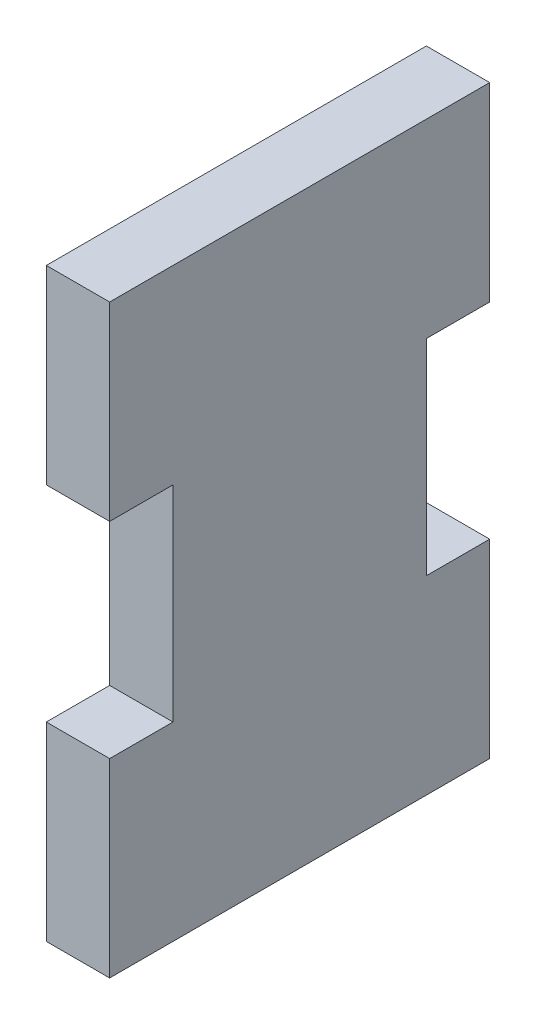
ISO-10303-21;
HEADER;
FILE_DESCRIPTION(('STEP AP214'),'2;1');
FILE_NAME('part.step','',(''),(''),'','','');
FILE_SCHEMA(('AUTOMOTIVE_DESIGN { 1 0 10303 214 1 1 1 1 }'));
ENDSEC;
DATA;
#1=APPLICATION_CONTEXT('core data for automotive mechanical design processes');
#2=APPLICATION_PROTOCOL_DEFINITION('international standard','automotive_design',2000,#1);
#3=PRODUCT_CONTEXT('',#1,'mechanical');
#4=PRODUCT('Part','Part','',(#3));
#5=PRODUCT_RELATED_PRODUCT_CATEGORY('part','',(#4));
#6=PRODUCT_DEFINITION_FORMATION('','',#4);
#7=PRODUCT_DEFINITION_CONTEXT('part definition',#1,'design');
#8=PRODUCT_DEFINITION('design','',#6,#7);
#9=PRODUCT_DEFINITION_SHAPE('','',#8);
#10=(LENGTH_UNIT() NAMED_UNIT(*) SI_UNIT(.MILLI.,.METRE.));
#11=(NAMED_UNIT(*) PLANE_ANGLE_UNIT() SI_UNIT($,.RADIAN.));
#12=(NAMED_UNIT(*) SI_UNIT($,.STERADIAN.) SOLID_ANGLE_UNIT());
#13=UNCERTAINTY_MEASURE_WITH_UNIT(LENGTH_MEASURE(1.E-05),#10,'distance_accuracy_value','');
#14=(GEOMETRIC_REPRESENTATION_CONTEXT(3) GLOBAL_UNCERTAINTY_ASSIGNED_CONTEXT((#13)) GLOBAL_UNIT_ASSIGNED_CONTEXT((#10,
#11,#12)) REPRESENTATION_CONTEXT('',''));
#15=CARTESIAN_POINT('',(0.,0.,0.));
#16=DIRECTION('',(0.,0.,1.));
#17=DIRECTION('',(1.,0.,0.));
#18=AXIS2_PLACEMENT_3D('',#15,#16,#17);
#19=CARTESIAN_POINT('',(170.787635416825,62.3441732811467,-19.05));
#20=DIRECTION('',(0.,0.,1.));
#21=DIRECTION('',(1.,0.,0.));
#22=AXIS2_PLACEMENT_3D('',#19,#20,#21);
#23=PLANE('',#22);
#24=DIRECTION('',(0.,-1.,0.));
#25=VECTOR('',#24,1.);
#26=CARTESIAN_POINT('',(80.8458073702656,63.0814486240607,-19.05));
#27=LINE('',#26,#25);
#28=CARTESIAN_POINT('',(80.8458073702656,72.6064486240607,-19.05));
#29=VERTEX_POINT('',#28);
#30=CARTESIAN_POINT('',(80.8458073702656,63.0814486240607,-19.05));
#31=VERTEX_POINT('',#30);
#32=EDGE_CURVE('E185',#29,#31,#27,.T.);
#33=ORIENTED_EDGE('',*,*,#32,.F.);
#34=DIRECTION('',(1.,0.,0.));
#35=VECTOR('',#34,1.);
#36=CARTESIAN_POINT('',(170.787635416825,72.6064486240607,-19.05));
#37=LINE('',#36,#35);
#38=CARTESIAN_POINT('',(84.0208073702656,72.6064486240607,-19.05));
#39=VERTEX_POINT('',#38);
#40=EDGE_CURVE('E11',#29,#39,#37,.T.);
#41=ORIENTED_EDGE('',*,*,#40,.T.);
#42=DIRECTION('',(0.,-1.,0.));
#43=VECTOR('',#42,1.);
#44=CARTESIAN_POINT('',(84.0208073702656,63.0814486240607,-19.05));
#45=LINE('',#44,#43);
#46=CARTESIAN_POINT('',(84.0208073702656,63.0814486240607,-19.05));
#47=VERTEX_POINT('',#46);
#48=EDGE_CURVE('E144',#39,#47,#45,.T.);
#49=ORIENTED_EDGE('',*,*,#48,.T.);
#50=DIRECTION('',(1.,0.,0.));
#51=VECTOR('',#50,1.);
#52=CARTESIAN_POINT('',(84.0208073702656,63.0814486240607,-19.05));
#53=LINE('',#52,#51);
#54=EDGE_CURVE('E147',#31,#47,#53,.T.);
#55=ORIENTED_EDGE('',*,*,#54,.F.);
#56=EDGE_LOOP('',(#33,#41,#49,#55));
#57=FACE_BOUND('',#56,.T.);
#58=ADVANCED_FACE('F33',(#57),#23,.F.);
#59=CARTESIAN_POINT('',(0.,0.,0.));
#60=DIRECTION('',(0.,0.,-1.));
#61=DIRECTION('',(-1.,0.,0.));
#62=AXIS2_PLACEMENT_3D('',#59,#60,#61);
#63=PLANE('',#62);
#64=DIRECTION('',(0.,1.,0.));
#65=VECTOR('',#64,1.);
#66=CARTESIAN_POINT('',(80.8458073702656,63.0814486240607,0.));
#67=LINE('',#66,#65);
#68=CARTESIAN_POINT('',(80.8458073702656,82.9011455937577,0.));
#69=VERTEX_POINT('',#68);
#70=CARTESIAN_POINT('',(80.8458073702656,92.4261455937577,0.));
#71=VERTEX_POINT('',#70);
#72=EDGE_CURVE('E159',#69,#71,#67,.T.);
#73=ORIENTED_EDGE('',*,*,#72,.F.);
#74=DIRECTION('',(1.,0.,0.));
#75=VECTOR('',#74,1.);
#76=CARTESIAN_POINT('',(0.,82.9011455937577,0.));
#77=LINE('',#76,#75);
#78=CARTESIAN_POINT('',(84.0208073702656,82.9011455937577,0.));
#79=VERTEX_POINT('',#78);
#80=EDGE_CURVE('E129',#69,#79,#77,.T.);
#81=ORIENTED_EDGE('',*,*,#80,.T.);
#82=DIRECTION('',(0.,1.,0.));
#83=VECTOR('',#82,1.);
#84=CARTESIAN_POINT('',(84.0208073702656,63.0814486240607,0.));
#85=LINE('',#84,#83);
#86=CARTESIAN_POINT('',(84.0208073702656,92.4261455937577,0.));
#87=VERTEX_POINT('',#86);
#88=EDGE_CURVE('E158',#79,#87,#85,.T.);
#89=ORIENTED_EDGE('',*,*,#88,.T.);
#90=DIRECTION('',(-1.,0.,0.));
#91=VECTOR('',#90,1.);
#92=CARTESIAN_POINT('',(84.0208073702656,92.4261455937577,0.));
#93=LINE('',#92,#91);
#94=EDGE_CURVE('E168',#87,#71,#93,.T.);
#95=ORIENTED_EDGE('',*,*,#94,.T.);
#96=EDGE_LOOP('',(#73,#81,#89,#95));
#97=FACE_BOUND('',#96,.T.);
#98=ADVANCED_FACE('F156',(#97),#63,.F.);
#99=CARTESIAN_POINT('',(84.0208073702656,63.0814486240607,-48.5659595006387));
#100=DIRECTION('',(0.,1.,0.));
#101=DIRECTION('',(0.,0.,1.));
#102=AXIS2_PLACEMENT_3D('',#99,#100,#101);
#103=PLANE('',#102);
#104=DIRECTION('',(0.,0.,1.));
#105=VECTOR('',#104,1.);
#106=CARTESIAN_POINT('',(80.8458073702656,63.0814486240607,-48.5659595006387));
#107=LINE('',#106,#105);
#108=CARTESIAN_POINT('',(80.8458073702656,63.0814486240607,0.));
#109=VERTEX_POINT('',#108);
#110=EDGE_CURVE('E149',#31,#109,#107,.T.);
#111=ORIENTED_EDGE('',*,*,#110,.F.);
#112=ORIENTED_EDGE('',*,*,#54,.T.);
#113=DIRECTION('',(0.,0.,1.));
#114=VECTOR('',#113,1.);
#115=CARTESIAN_POINT('',(84.0208073702656,63.0814486240607,-48.5659595006387));
#116=LINE('',#115,#114);
#117=CARTESIAN_POINT('',(84.0208073702656,63.0814486240607,0.));
#118=VERTEX_POINT('',#117);
#119=EDGE_CURVE('E171',#47,#118,#116,.T.);
#120=ORIENTED_EDGE('',*,*,#119,.T.);
#121=DIRECTION('',(-1.,0.,0.));
#122=VECTOR('',#121,1.);
#123=CARTESIAN_POINT('',(84.0208073702656,63.0814486240607,0.));
#124=LINE('',#123,#122);
#125=EDGE_CURVE('E195',#118,#109,#124,.T.);
#126=ORIENTED_EDGE('',*,*,#125,.T.);
#127=EDGE_LOOP('',(#111,#112,#120,#126));
#128=FACE_BOUND('',#127,.T.);
#129=ADVANCED_FACE('F35',(#128),#103,.F.);
#130=CARTESIAN_POINT('',(80.8458073702656,63.0814486240607,-48.5659595006387));
#131=DIRECTION('',(1.,0.,0.));
#132=DIRECTION('',(0.,0.,-1.));
#133=AXIS2_PLACEMENT_3D('',#130,#131,#132);
#134=PLANE('',#133);
#135=DIRECTION('',(0.,-1.,0.));
#136=VECTOR('',#135,1.);
#137=CARTESIAN_POINT('',(80.8458073702656,63.0814486240607,-15.875));
#138=LINE('',#137,#136);
#139=CARTESIAN_POINT('',(80.8458073702656,82.9011455937577,-15.875));
#140=VERTEX_POINT('',#139);
#141=CARTESIAN_POINT('',(80.8458073702656,72.6064486240607,-15.875));
#142=VERTEX_POINT('',#141);
#143=EDGE_CURVE('E215',#140,#142,#138,.T.);
#144=ORIENTED_EDGE('',*,*,#143,.T.);
#145=DIRECTION('',(0.,0.,-1.));
#146=VECTOR('',#145,1.);
#147=CARTESIAN_POINT('',(80.8458073702656,72.6064486240607,-48.5659595006387));
#148=LINE('',#147,#146);
#149=EDGE_CURVE('E217',#142,#29,#148,.T.);
#150=ORIENTED_EDGE('',*,*,#149,.T.);
#151=ORIENTED_EDGE('',*,*,#32,.T.);
#152=ORIENTED_EDGE('',*,*,#110,.T.);
#153=CARTESIAN_POINT('',(80.8458073702656,72.6064486240607,0.));
#154=VERTEX_POINT('',#153);
#155=EDGE_CURVE('E172',#109,#154,#67,.T.);
#156=ORIENTED_EDGE('',*,*,#155,.T.);
#157=DIRECTION('',(0.,0.,-1.));
#158=VECTOR('',#157,1.);
#159=CARTESIAN_POINT('',(80.8458073702656,72.6064486240607,-48.5659595006387));
#160=LINE('',#159,#158);
#161=CARTESIAN_POINT('',(80.8458073702656,72.6064486240607,-3.175));
#162=VERTEX_POINT('',#161);
#163=EDGE_CURVE('E56',#154,#162,#160,.T.);
#164=ORIENTED_EDGE('',*,*,#163,.T.);
#165=DIRECTION('',(0.,1.,0.));
#166=VECTOR('',#165,1.);
#167=CARTESIAN_POINT('',(80.8458073702656,63.0814486240607,-3.175));
#168=LINE('',#167,#166);
#169=CARTESIAN_POINT('',(80.8458073702656,82.9011455937577,-3.175));
#170=VERTEX_POINT('',#169);
#171=EDGE_CURVE('E190',#162,#170,#168,.T.);
#172=ORIENTED_EDGE('',*,*,#171,.T.);
#173=DIRECTION('',(0.,0.,1.));
#174=VECTOR('',#173,1.);
#175=CARTESIAN_POINT('',(80.8458073702656,82.9011455937577,-48.5659595006387));
#176=LINE('',#175,#174);
#177=EDGE_CURVE('E200',#170,#69,#176,.T.);
#178=ORIENTED_EDGE('',*,*,#177,.T.);
#179=ORIENTED_EDGE('',*,*,#72,.T.);
#180=DIRECTION('',(0.,0.,1.));
#181=VECTOR('',#180,1.);
#182=CARTESIAN_POINT('',(80.8458073702656,92.4261455937577,-48.5659595006387));
#183=LINE('',#182,#181);
#184=CARTESIAN_POINT('',(80.8458073702656,92.4261455937577,-19.05));
#185=VERTEX_POINT('',#184);
#186=EDGE_CURVE('E177',#185,#71,#183,.T.);
#187=ORIENTED_EDGE('',*,*,#186,.F.);
#188=CARTESIAN_POINT('',(80.8458073702656,82.9011455937577,-19.05));
#189=VERTEX_POINT('',#188);
#190=EDGE_CURVE('E187',#185,#189,#27,.T.);
#191=ORIENTED_EDGE('',*,*,#190,.T.);
#192=DIRECTION('',(0.,0.,1.));
#193=VECTOR('',#192,1.);
#194=CARTESIAN_POINT('',(80.8458073702656,82.9011455937577,-48.5659595006387));
#195=LINE('',#194,#193);
#196=EDGE_CURVE('E48',#189,#140,#195,.T.);
#197=ORIENTED_EDGE('',*,*,#196,.T.);
#198=EDGE_LOOP('',(#144,#150,#151,#152,#156,#164,#172,#178,#179,#187,#191,#197));
#199=FACE_BOUND('',#198,.T.);
#200=ADVANCED_FACE('F198',(#199),#134,.F.);
#201=CARTESIAN_POINT('',(84.0208073702656,92.4261455937577,-48.5659595006387));
#202=DIRECTION('',(0.,1.,0.));
#203=DIRECTION('',(0.,0.,1.));
#204=AXIS2_PLACEMENT_3D('',#201,#202,#203);
#205=PLANE('',#204);
#206=DIRECTION('',(1.,0.,0.));
#207=VECTOR('',#206,1.);
#208=CARTESIAN_POINT('',(84.0208073702656,92.4261455937577,-19.05));
#209=LINE('',#208,#207);
#210=CARTESIAN_POINT('',(84.0208073702656,92.4261455937577,-19.05));
#211=VERTEX_POINT('',#210);
#212=EDGE_CURVE('E141',#185,#211,#209,.T.);
#213=ORIENTED_EDGE('',*,*,#212,.F.);
#214=ORIENTED_EDGE('',*,*,#186,.T.);
#215=ORIENTED_EDGE('',*,*,#94,.F.);
#216=DIRECTION('',(0.,0.,1.));
#217=VECTOR('',#216,1.);
#218=CARTESIAN_POINT('',(84.0208073702656,92.4261455937577,-48.5659595006387));
#219=LINE('',#218,#217);
#220=EDGE_CURVE('E165',#211,#87,#219,.T.);
#221=ORIENTED_EDGE('',*,*,#220,.F.);
#222=EDGE_LOOP('',(#213,#214,#215,#221));
#223=FACE_BOUND('',#222,.T.);
#224=ADVANCED_FACE('F237',(#223),#205,.T.);
#225=CARTESIAN_POINT('',(84.0208073702656,63.0814486240607,-48.5659595006387));
#226=DIRECTION('',(1.,0.,0.));
#227=DIRECTION('',(0.,0.,-1.));
#228=AXIS2_PLACEMENT_3D('',#225,#226,#227);
#229=PLANE('',#228);
#230=DIRECTION('',(0.,0.,-1.));
#231=VECTOR('',#230,1.);
#232=CARTESIAN_POINT('',(84.0208073702656,72.6064486240607,-19.05));
#233=LINE('',#232,#231);
#234=CARTESIAN_POINT('',(84.0208073702656,72.6064486240607,-15.875));
#235=VERTEX_POINT('',#234);
#236=EDGE_CURVE('E224',#235,#39,#233,.T.);
#237=ORIENTED_EDGE('',*,*,#236,.F.);
#238=DIRECTION('',(0.,-1.,0.));
#239=VECTOR('',#238,1.);
#240=CARTESIAN_POINT('',(84.0208073702656,82.9011455937577,-15.875));
#241=LINE('',#240,#239);
#242=CARTESIAN_POINT('',(84.0208073702656,82.9011455937577,-15.875));
#243=VERTEX_POINT('',#242);
#244=EDGE_CURVE('E137',#243,#235,#241,.T.);
#245=ORIENTED_EDGE('',*,*,#244,.F.);
#246=DIRECTION('',(0.,0.,1.));
#247=VECTOR('',#246,1.);
#248=CARTESIAN_POINT('',(84.0208073702656,82.9011455937577,-19.05));
#249=LINE('',#248,#247);
#250=CARTESIAN_POINT('',(84.0208073702656,82.9011455937577,-19.05));
#251=VERTEX_POINT('',#250);
#252=EDGE_CURVE('E124',#251,#243,#249,.T.);
#253=ORIENTED_EDGE('',*,*,#252,.F.);
#254=EDGE_CURVE('E135',#211,#251,#45,.T.);
#255=ORIENTED_EDGE('',*,*,#254,.F.);
#256=ORIENTED_EDGE('',*,*,#220,.T.);
#257=ORIENTED_EDGE('',*,*,#88,.F.);
#258=DIRECTION('',(0.,0.,1.));
#259=VECTOR('',#258,1.);
#260=CARTESIAN_POINT('',(84.0208073702656,82.9011455937577,0.));
#261=LINE('',#260,#259);
#262=CARTESIAN_POINT('',(84.0208073702656,82.9011455937577,-3.175));
#263=VERTEX_POINT('',#262);
#264=EDGE_CURVE('E164',#263,#79,#261,.T.);
#265=ORIENTED_EDGE('',*,*,#264,.F.);
#266=DIRECTION('',(0.,1.,0.));
#267=VECTOR('',#266,1.);
#268=CARTESIAN_POINT('',(84.0208073702656,72.6064486240607,-3.175));
#269=LINE('',#268,#267);
#270=CARTESIAN_POINT('',(84.0208073702656,72.6064486240607,-3.175));
#271=VERTEX_POINT('',#270);
#272=EDGE_CURVE('E209',#271,#263,#269,.T.);
#273=ORIENTED_EDGE('',*,*,#272,.F.);
#274=DIRECTION('',(0.,0.,-1.));
#275=VECTOR('',#274,1.);
#276=CARTESIAN_POINT('',(84.0208073702656,72.6064486240607,0.));
#277=LINE('',#276,#275);
#278=CARTESIAN_POINT('',(84.0208073702656,72.6064486240607,0.));
#279=VERTEX_POINT('',#278);
#280=EDGE_CURVE('E212',#279,#271,#277,.T.);
#281=ORIENTED_EDGE('',*,*,#280,.F.);
#282=EDGE_CURVE('E167',#118,#279,#85,.T.);
#283=ORIENTED_EDGE('',*,*,#282,.F.);
#284=ORIENTED_EDGE('',*,*,#119,.F.);
#285=ORIENTED_EDGE('',*,*,#48,.F.);
#286=EDGE_LOOP('',(#237,#245,#253,#255,#256,#257,#265,#273,#281,#283,#284,#285));
#287=FACE_BOUND('',#286,.T.);
#288=ADVANCED_FACE('F133',(#287),#229,.T.);
#289=ORIENTED_EDGE('',*,*,#282,.T.);
#290=DIRECTION('',(-1.,0.,0.));
#291=VECTOR('',#290,1.);
#292=CARTESIAN_POINT('',(0.,72.6064486240607,0.));
#293=LINE('',#292,#291);
#294=EDGE_CURVE('E143',#279,#154,#293,.T.);
#295=ORIENTED_EDGE('',*,*,#294,.T.);
#296=ORIENTED_EDGE('',*,*,#155,.F.);
#297=ORIENTED_EDGE('',*,*,#125,.F.);
#298=EDGE_LOOP('',(#289,#295,#296,#297));
#299=FACE_BOUND('',#298,.T.);
#300=ADVANCED_FACE('F244',(#299),#63,.F.);
#301=ORIENTED_EDGE('',*,*,#254,.T.);
#302=DIRECTION('',(-1.,0.,0.));
#303=VECTOR('',#302,1.);
#304=CARTESIAN_POINT('',(170.787635416825,82.9011455937577,-19.05));
#305=LINE('',#304,#303);
#306=EDGE_CURVE('E41',#251,#189,#305,.T.);
#307=ORIENTED_EDGE('',*,*,#306,.T.);
#308=ORIENTED_EDGE('',*,*,#190,.F.);
#309=ORIENTED_EDGE('',*,*,#212,.T.);
#310=EDGE_LOOP('',(#301,#307,#308,#309));
#311=FACE_BOUND('',#310,.T.);
#312=ADVANCED_FACE('F139',(#311),#23,.F.);
#313=CARTESIAN_POINT('',(78.9408073702656,72.6064486240607,-3.175));
#314=DIRECTION('',(0.,0.,-1.));
#315=DIRECTION('',(-1.,0.,0.));
#316=AXIS2_PLACEMENT_3D('',#313,#314,#315);
#317=PLANE('',#316);
#318=DIRECTION('',(1.,0.,0.));
#319=VECTOR('',#318,1.);
#320=CARTESIAN_POINT('',(78.9408073702656,72.6064486240607,-3.175));
#321=LINE('',#320,#319);
#322=EDGE_CURVE('E205',#162,#271,#321,.T.);
#323=ORIENTED_EDGE('',*,*,#322,.T.);
#324=ORIENTED_EDGE('',*,*,#272,.T.);
#325=DIRECTION('',(1.,0.,0.));
#326=VECTOR('',#325,1.);
#327=CARTESIAN_POINT('',(78.9408073702656,82.9011455937577,-3.175));
#328=LINE('',#327,#326);
#329=EDGE_CURVE('E202',#170,#263,#328,.T.);
#330=ORIENTED_EDGE('',*,*,#329,.F.);
#331=ORIENTED_EDGE('',*,*,#171,.F.);
#332=EDGE_LOOP('',(#323,#324,#330,#331));
#333=FACE_BOUND('',#332,.T.);
#334=ADVANCED_FACE('F254',(#333),#317,.F.);
#335=CARTESIAN_POINT('',(78.9408073702656,82.9011455937577,0.));
#336=DIRECTION('',(0.,1.,0.));
#337=DIRECTION('',(0.,0.,1.));
#338=AXIS2_PLACEMENT_3D('',#335,#336,#337);
#339=PLANE('',#338);
#340=ORIENTED_EDGE('',*,*,#329,.T.);
#341=ORIENTED_EDGE('',*,*,#264,.T.);
#342=ORIENTED_EDGE('',*,*,#80,.F.);
#343=ORIENTED_EDGE('',*,*,#177,.F.);
#344=EDGE_LOOP('',(#340,#341,#342,#343));
#345=FACE_BOUND('',#344,.T.);
#346=ADVANCED_FACE('F259',(#345),#339,.F.);
#347=CARTESIAN_POINT('',(78.9408073702656,72.6064486240607,0.));
#348=DIRECTION('',(0.,-1.,0.));
#349=DIRECTION('',(0.,0.,-1.));
#350=AXIS2_PLACEMENT_3D('',#347,#348,#349);
#351=PLANE('',#350);
#352=ORIENTED_EDGE('',*,*,#294,.F.);
#353=ORIENTED_EDGE('',*,*,#280,.T.);
#354=ORIENTED_EDGE('',*,*,#322,.F.);
#355=ORIENTED_EDGE('',*,*,#163,.F.);
#356=EDGE_LOOP('',(#352,#353,#354,#355));
#357=FACE_BOUND('',#356,.T.);
#358=ADVANCED_FACE('F268',(#357),#351,.F.);
#359=CARTESIAN_POINT('',(78.9408073702656,82.9011455937577,-15.875));
#360=DIRECTION('',(0.,0.,1.));
#361=DIRECTION('',(1.,0.,0.));
#362=AXIS2_PLACEMENT_3D('',#359,#360,#361);
#363=PLANE('',#362);
#364=DIRECTION('',(1.,0.,0.));
#365=VECTOR('',#364,1.);
#366=CARTESIAN_POINT('',(78.9408073702656,82.9011455937577,-15.875));
#367=LINE('',#366,#365);
#368=EDGE_CURVE('E222',#140,#243,#367,.T.);
#369=ORIENTED_EDGE('',*,*,#368,.T.);
#370=ORIENTED_EDGE('',*,*,#244,.T.);
#371=DIRECTION('',(1.,0.,0.));
#372=VECTOR('',#371,1.);
#373=CARTESIAN_POINT('',(78.9408073702656,72.6064486240607,-15.875));
#374=LINE('',#373,#372);
#375=EDGE_CURVE('E221',#142,#235,#374,.T.);
#376=ORIENTED_EDGE('',*,*,#375,.F.);
#377=ORIENTED_EDGE('',*,*,#143,.F.);
#378=EDGE_LOOP('',(#369,#370,#376,#377));
#379=FACE_BOUND('',#378,.T.);
#380=ADVANCED_FACE('F229',(#379),#363,.F.);
#381=CARTESIAN_POINT('',(78.9408073702656,72.6064486240607,-19.05));
#382=DIRECTION('',(0.,-1.,0.));
#383=DIRECTION('',(0.,0.,-1.));
#384=AXIS2_PLACEMENT_3D('',#381,#382,#383);
#385=PLANE('',#384);
#386=ORIENTED_EDGE('',*,*,#375,.T.);
#387=ORIENTED_EDGE('',*,*,#236,.T.);
#388=ORIENTED_EDGE('',*,*,#40,.F.);
#389=ORIENTED_EDGE('',*,*,#149,.F.);
#390=EDGE_LOOP('',(#386,#387,#388,#389));
#391=FACE_BOUND('',#390,.T.);
#392=ADVANCED_FACE('F233',(#391),#385,.F.);
#393=CARTESIAN_POINT('',(78.9408073702656,82.9011455937577,-19.05));
#394=DIRECTION('',(0.,1.,0.));
#395=DIRECTION('',(0.,0.,1.));
#396=AXIS2_PLACEMENT_3D('',#393,#394,#395);
#397=PLANE('',#396);
#398=ORIENTED_EDGE('',*,*,#306,.F.);
#399=ORIENTED_EDGE('',*,*,#252,.T.);
#400=ORIENTED_EDGE('',*,*,#368,.F.);
#401=ORIENTED_EDGE('',*,*,#196,.F.);
#402=EDGE_LOOP('',(#398,#399,#400,#401));
#403=FACE_BOUND('',#402,.T.);
#404=ADVANCED_FACE('F123',(#403),#397,.F.);
#405=CLOSED_SHELL('',(#58,#98,#129,#200,#224,#288,#300,#312,#334,#346,#358,#380,#392,#404));
#406=MANIFOLD_SOLID_BREP('B2',#405);
#407=ADVANCED_BREP_SHAPE_REPRESENTATION('',(#18,#406),#14);
#408=SHAPE_DEFINITION_REPRESENTATION(#9,#407);
ENDSEC;
END-ISO-10303-21;
